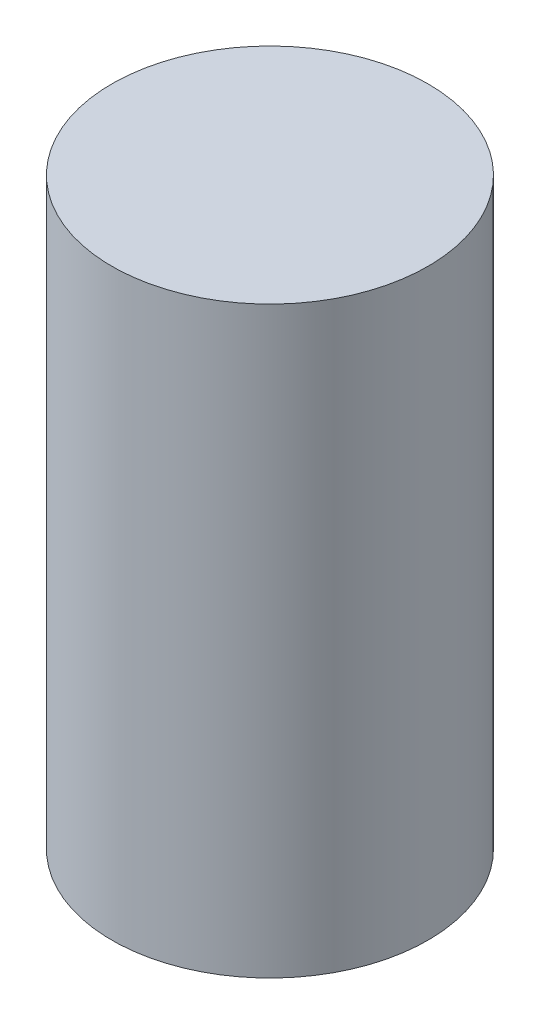
ISO-10303-21;
HEADER;
FILE_DESCRIPTION(('STEP AP214'),'2;1');
FILE_NAME('part.step','',(''),(''),'','','');
FILE_SCHEMA(('AUTOMOTIVE_DESIGN { 1 0 10303 214 1 1 1 1 }'));
ENDSEC;
DATA;
#1=APPLICATION_CONTEXT('core data for automotive mechanical design processes');
#2=APPLICATION_PROTOCOL_DEFINITION('international standard','automotive_design',2000,#1);
#3=PRODUCT_CONTEXT('',#1,'mechanical');
#4=PRODUCT('Part','Part','',(#3));
#5=PRODUCT_RELATED_PRODUCT_CATEGORY('part','',(#4));
#6=PRODUCT_DEFINITION_FORMATION('','',#4);
#7=PRODUCT_DEFINITION_CONTEXT('part definition',#1,'design');
#8=PRODUCT_DEFINITION('design','',#6,#7);
#9=PRODUCT_DEFINITION_SHAPE('','',#8);
#10=(LENGTH_UNIT() NAMED_UNIT(*) SI_UNIT(.MILLI.,.METRE.));
#11=(NAMED_UNIT(*) PLANE_ANGLE_UNIT() SI_UNIT($,.RADIAN.));
#12=(NAMED_UNIT(*) SI_UNIT($,.STERADIAN.) SOLID_ANGLE_UNIT());
#13=UNCERTAINTY_MEASURE_WITH_UNIT(LENGTH_MEASURE(1.E-05),#10,'distance_accuracy_value','');
#14=(GEOMETRIC_REPRESENTATION_CONTEXT(3) GLOBAL_UNCERTAINTY_ASSIGNED_CONTEXT((#13)) GLOBAL_UNIT_ASSIGNED_CONTEXT((#10,
#11,#12)) REPRESENTATION_CONTEXT('',''));
#15=CARTESIAN_POINT('',(0.,0.,0.));
#16=DIRECTION('',(0.,0.,1.));
#17=DIRECTION('',(1.,0.,0.));
#18=AXIS2_PLACEMENT_3D('',#15,#16,#17);
#19=CARTESIAN_POINT('',(0.,76.2,0.));
#20=DIRECTION('',(0.,-1.,0.));
#21=DIRECTION('',(0.,0.,-1.));
#22=AXIS2_PLACEMENT_3D('',#19,#20,#21);
#23=CYLINDRICAL_SURFACE('',#22,20.6375);
#24=CARTESIAN_POINT('',(0.,76.2,0.));
#25=DIRECTION('',(0.,1.,0.));
#26=DIRECTION('',(0.,0.,1.));
#27=AXIS2_PLACEMENT_3D('',#24,#25,#26);
#28=CIRCLE('',#27,20.6375);
#29=CARTESIAN_POINT('',(0.,76.2,-20.6375));
#30=VERTEX_POINT('',#29);
#31=EDGE_CURVE('E10',#30,#30,#28,.T.);
#32=CARTESIAN_POINT('',(0.,0.,0.));
#33=DIRECTION('',(0.,1.,0.));
#34=DIRECTION('',(0.,0.,1.));
#35=AXIS2_PLACEMENT_3D('',#32,#33,#34);
#36=CIRCLE('',#35,20.6375);
#37=CARTESIAN_POINT('',(0.,0.,-20.6375));
#38=VERTEX_POINT('',#37);
#39=EDGE_CURVE('E40',#38,#38,#36,.T.);
#40=CARTESIAN_POINT('',(0.,76.2,-20.6375));
#41=CARTESIAN_POINT('',(0.,75.40625,-20.6375));
#42=CARTESIAN_POINT('',(0.,74.6125,-20.6375));
#43=CARTESIAN_POINT('',(0.,73.025,-20.6375));
#44=CARTESIAN_POINT('',(0.,72.23125,-20.6375));
#45=CARTESIAN_POINT('',(0.,70.64375,-20.6375));
#46=CARTESIAN_POINT('',(0.,69.85,-20.6375));
#47=CARTESIAN_POINT('',(0.,68.2625,-20.6375));
#48=CARTESIAN_POINT('',(0.,67.46875,-20.6375));
#49=CARTESIAN_POINT('',(0.,65.88125,-20.6375));
#50=CARTESIAN_POINT('',(0.,65.0875,-20.6375));
#51=CARTESIAN_POINT('',(0.,63.5,-20.6375));
#52=CARTESIAN_POINT('',(0.,62.70625,-20.6375));
#53=CARTESIAN_POINT('',(0.,61.11875,-20.6375));
#54=CARTESIAN_POINT('',(0.,60.325,-20.6375));
#55=CARTESIAN_POINT('',(0.,58.7375,-20.6375));
#56=CARTESIAN_POINT('',(0.,57.94375,-20.6375));
#57=CARTESIAN_POINT('',(0.,56.35625,-20.6375));
#58=CARTESIAN_POINT('',(0.,55.5625,-20.6375));
#59=CARTESIAN_POINT('',(0.,53.975,-20.6375));
#60=CARTESIAN_POINT('',(0.,53.18125,-20.6375));
#61=CARTESIAN_POINT('',(0.,51.59375,-20.6375));
#62=CARTESIAN_POINT('',(0.,50.8,-20.6375));
#63=CARTESIAN_POINT('',(0.,49.2125,-20.6375));
#64=CARTESIAN_POINT('',(0.,48.41875,-20.6375));
#65=CARTESIAN_POINT('',(0.,46.83125,-20.6375));
#66=CARTESIAN_POINT('',(0.,46.0375,-20.6375));
#67=CARTESIAN_POINT('',(0.,44.45,-20.6375));
#68=CARTESIAN_POINT('',(0.,43.65625,-20.6375));
#69=CARTESIAN_POINT('',(0.,42.06875,-20.6375));
#70=CARTESIAN_POINT('',(0.,41.275,-20.6375));
#71=CARTESIAN_POINT('',(0.,39.6875,-20.6375));
#72=CARTESIAN_POINT('',(0.,38.89375,-20.6375));
#73=CARTESIAN_POINT('',(0.,37.30625,-20.6375));
#74=CARTESIAN_POINT('',(0.,36.5125,-20.6375));
#75=CARTESIAN_POINT('',(0.,34.925,-20.6375));
#76=CARTESIAN_POINT('',(0.,34.13125,-20.6375));
#77=CARTESIAN_POINT('',(0.,32.54375,-20.6375));
#78=CARTESIAN_POINT('',(0.,31.75,-20.6375));
#79=CARTESIAN_POINT('',(0.,30.1625,-20.6375));
#80=CARTESIAN_POINT('',(0.,29.36875,-20.6375));
#81=CARTESIAN_POINT('',(0.,27.78125,-20.6375));
#82=CARTESIAN_POINT('',(0.,26.9875,-20.6375));
#83=CARTESIAN_POINT('',(0.,25.4,-20.6375));
#84=CARTESIAN_POINT('',(0.,24.60625,-20.6375));
#85=CARTESIAN_POINT('',(0.,23.01875,-20.6375));
#86=CARTESIAN_POINT('',(0.,22.225,-20.6375));
#87=CARTESIAN_POINT('',(0.,20.6375,-20.6375));
#88=CARTESIAN_POINT('',(0.,19.84375,-20.6375));
#89=CARTESIAN_POINT('',(0.,18.25625,-20.6375));
#90=CARTESIAN_POINT('',(0.,17.4625,-20.6375));
#91=CARTESIAN_POINT('',(0.,15.875,-20.6375));
#92=CARTESIAN_POINT('',(0.,15.08125,-20.6375));
#93=CARTESIAN_POINT('',(0.,13.49375,-20.6375));
#94=CARTESIAN_POINT('',(0.,12.7,-20.6375));
#95=CARTESIAN_POINT('',(0.,11.1125,-20.6375));
#96=CARTESIAN_POINT('',(0.,10.31875,-20.6375));
#97=CARTESIAN_POINT('',(0.,8.73125,-20.6375));
#98=CARTESIAN_POINT('',(0.,7.93750000000001,-20.6375));
#99=CARTESIAN_POINT('',(0.,6.35,-20.6375));
#100=CARTESIAN_POINT('',(0.,5.55625,-20.6375));
#101=CARTESIAN_POINT('',(0.,3.96875,-20.6375));
#102=CARTESIAN_POINT('',(0.,3.175,-20.6375));
#103=CARTESIAN_POINT('',(0.,1.5875,-20.6375));
#104=CARTESIAN_POINT('',(0.,0.793750000000001,-20.6375));
#105=CARTESIAN_POINT('',(0.,0.,-20.6375));
#106=B_SPLINE_CURVE_WITH_KNOTS('',3,(#40,#41,#42,#43,#44,#45,#46,#47,#48,#49,#50,#51,#52,#53,
#54,#55,#56,#57,#58,#59,#60,#61,#62,#63,#64,#65,#66,#67,#68,#69,#70,#71,#72,#73,#74,#75,#76,#77,
#78,#79,#80,#81,#82,#83,#84,#85,#86,#87,#88,#89,#90,#91,#92,#93,#94,#95,#96,#97,#98,#99,#100,
#101,#102,#103,#104,#105),.UNSPECIFIED.,.F.,.F.,(4,2,2,2,2,2,2,2,2,2,2,2,2,2,2,2,2,2,2,2,2,2,2,
2,2,2,2,2,2,2,2,2,4),(0.,2.38124999999999,4.76249999999999,7.14374999999999,9.52499999999999,
11.90625,14.2875,16.66875,19.05,21.43125,23.8125,26.19375,28.575,30.95625,33.3375,35.71875,38.1,
40.48125,42.8625,45.24375,47.625,50.00625,52.3875,54.76875,57.15,59.53125,61.9125,64.29375,
66.675,69.05625,71.4375,73.81875,76.2),.UNSPECIFIED.);
#107=EDGE_CURVE('BSEAM37',#30,#38,#106,.T.);
#108=ORIENTED_EDGE('',*,*,#31,.F.);
#109=ORIENTED_EDGE('',*,*,#39,.T.);
#110=ORIENTED_EDGE('',*,*,#107,.T.);
#111=ORIENTED_EDGE('',*,*,#107,.F.);
#112=EDGE_LOOP('',(#108,#110,#109,#111));
#113=FACE_BOUND('',#112,.T.);
#114=ADVANCED_FACE('F37',(#113),#23,.T.);
#115=CARTESIAN_POINT('',(0.,76.2,0.));
#116=DIRECTION('',(0.,1.,0.));
#117=DIRECTION('',(0.,0.,1.));
#118=AXIS2_PLACEMENT_3D('',#115,#116,#117);
#119=PLANE('',#118);
#120=ORIENTED_EDGE('',*,*,#31,.T.);
#121=EDGE_LOOP('',(#120));
#122=FACE_BOUND('',#121,.T.);
#123=ADVANCED_FACE('F54',(#122),#119,.T.);
#124=CARTESIAN_POINT('',(0.,0.,0.));
#125=DIRECTION('',(0.,1.,0.));
#126=DIRECTION('',(0.,0.,1.));
#127=AXIS2_PLACEMENT_3D('',#124,#125,#126);
#128=PLANE('',#127);
#129=ORIENTED_EDGE('',*,*,#39,.F.);
#130=EDGE_LOOP('',(#129));
#131=FACE_BOUND('',#130,.T.);
#132=ADVANCED_FACE('F52',(#131),#128,.F.);
#133=CLOSED_SHELL('',(#114,#123,#132));
#134=MANIFOLD_SOLID_BREP('B2',#133);
#135=ADVANCED_BREP_SHAPE_REPRESENTATION('',(#18,#134),#14);
#136=SHAPE_DEFINITION_REPRESENTATION(#9,#135);
ENDSEC;
END-ISO-10303-21;
